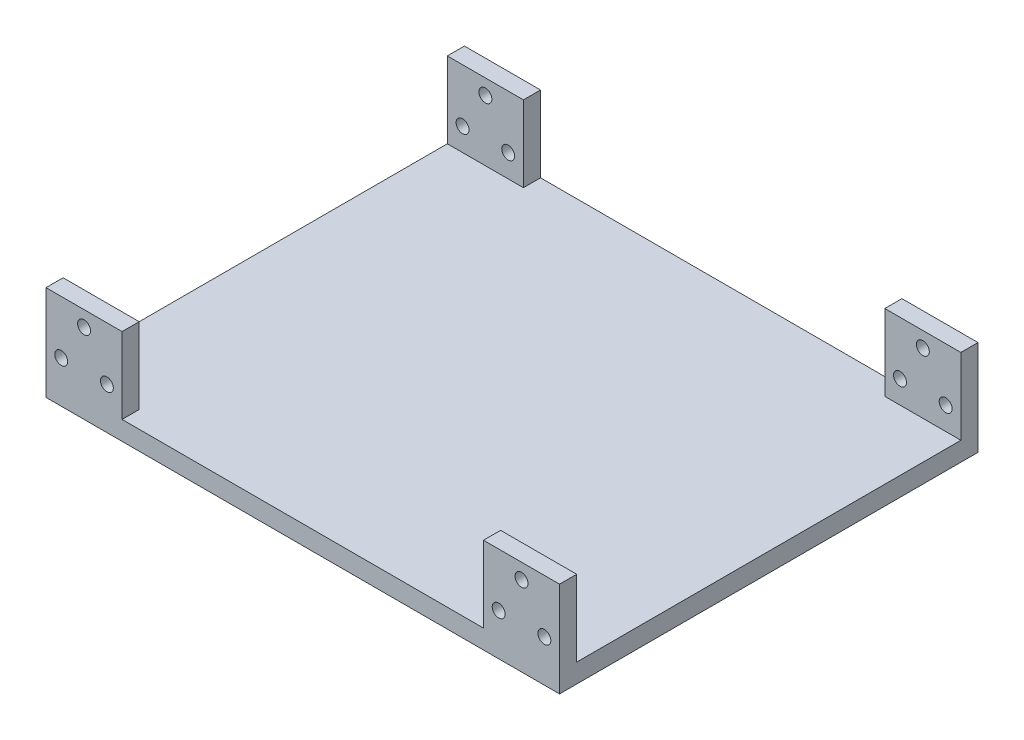
ISO-10303-21;
HEADER;
FILE_DESCRIPTION(('STEP AP214'),'2;1');
FILE_NAME('part.step','',(''),(''),'','','');
FILE_SCHEMA(('AUTOMOTIVE_DESIGN { 1 0 10303 214 1 1 1 1 }'));
ENDSEC;
DATA;
#1=APPLICATION_CONTEXT('core data for automotive mechanical design processes');
#2=APPLICATION_PROTOCOL_DEFINITION('international standard','automotive_design',2000,#1);
#3=PRODUCT_CONTEXT('',#1,'mechanical');
#4=PRODUCT('Part','Part','',(#3));
#5=PRODUCT_RELATED_PRODUCT_CATEGORY('part','',(#4));
#6=PRODUCT_DEFINITION_FORMATION('','',#4);
#7=PRODUCT_DEFINITION_CONTEXT('part definition',#1,'design');
#8=PRODUCT_DEFINITION('design','',#6,#7);
#9=PRODUCT_DEFINITION_SHAPE('','',#8);
#10=(LENGTH_UNIT() NAMED_UNIT(*) SI_UNIT(.MILLI.,.METRE.));
#11=(NAMED_UNIT(*) PLANE_ANGLE_UNIT() SI_UNIT($,.RADIAN.));
#12=(NAMED_UNIT(*) SI_UNIT($,.STERADIAN.) SOLID_ANGLE_UNIT());
#13=UNCERTAINTY_MEASURE_WITH_UNIT(LENGTH_MEASURE(1.E-05),#10,'distance_accuracy_value','');
#14=(GEOMETRIC_REPRESENTATION_CONTEXT(3) GLOBAL_UNCERTAINTY_ASSIGNED_CONTEXT((#13)) GLOBAL_UNIT_ASSIGNED_CONTEXT((#10,
#11,#12)) REPRESENTATION_CONTEXT('',''));
#15=CARTESIAN_POINT('',(0.,0.,0.));
#16=DIRECTION('',(0.,0.,1.));
#17=DIRECTION('',(1.,0.,0.));
#18=AXIS2_PLACEMENT_3D('',#15,#16,#17);
#19=CARTESIAN_POINT('',(0.,5.,0.));
#20=DIRECTION('',(0.,-1.,0.));
#21=DIRECTION('',(0.,0.,-1.));
#22=AXIS2_PLACEMENT_3D('',#19,#20,#21);
#23=PLANE('',#22);
#24=DIRECTION('',(-1.,0.,0.));
#25=VECTOR('',#24,1.);
#26=CARTESIAN_POINT('',(67.5,5.,50.5));
#27=LINE('',#26,#25);
#28=CARTESIAN_POINT('',(67.5,5.,50.5));
#29=VERTEX_POINT('',#28);
#30=CARTESIAN_POINT('',(47.5,5.,50.5));
#31=VERTEX_POINT('',#30);
#32=EDGE_CURVE('E61',#29,#31,#27,.T.);
#33=ORIENTED_EDGE('',*,*,#32,.F.);
#34=DIRECTION('',(0.,0.,-1.));
#35=VECTOR('',#34,1.);
#36=CARTESIAN_POINT('',(67.5,5.,55.));
#37=LINE('',#36,#35);
#38=CARTESIAN_POINT('',(67.5,5.,-50.5));
#39=VERTEX_POINT('',#38);
#40=EDGE_CURVE('E305',#29,#39,#37,.T.);
#41=ORIENTED_EDGE('',*,*,#40,.T.);
#42=DIRECTION('',(1.,0.,0.));
#43=VECTOR('',#42,1.);
#44=CARTESIAN_POINT('',(67.5,5.,-50.5));
#45=LINE('',#44,#43);
#46=CARTESIAN_POINT('',(47.5,5.,-50.5));
#47=VERTEX_POINT('',#46);
#48=EDGE_CURVE('E277',#47,#39,#45,.T.);
#49=ORIENTED_EDGE('',*,*,#48,.F.);
#50=DIRECTION('',(0.,0.,1.));
#51=VECTOR('',#50,1.);
#52=CARTESIAN_POINT('',(47.5,5.,-55.));
#53=LINE('',#52,#51);
#54=CARTESIAN_POINT('',(47.5,5.,-55.));
#55=VERTEX_POINT('',#54);
#56=EDGE_CURVE('E271',#55,#47,#53,.T.);
#57=ORIENTED_EDGE('',*,*,#56,.F.);
#58=DIRECTION('',(-1.,0.,0.));
#59=VECTOR('',#58,1.);
#60=CARTESIAN_POINT('',(-67.5,5.,-55.));
#61=LINE('',#60,#59);
#62=CARTESIAN_POINT('',(-47.5,5.,-55.));
#63=VERTEX_POINT('',#62);
#64=EDGE_CURVE('E308',#55,#63,#61,.T.);
#65=ORIENTED_EDGE('',*,*,#64,.T.);
#66=DIRECTION('',(0.,0.,-1.));
#67=VECTOR('',#66,1.);
#68=CARTESIAN_POINT('',(-47.5,5.,-55.));
#69=LINE('',#68,#67);
#70=CARTESIAN_POINT('',(-47.5,5.,-50.5));
#71=VERTEX_POINT('',#70);
#72=EDGE_CURVE('E244',#71,#63,#69,.T.);
#73=ORIENTED_EDGE('',*,*,#72,.F.);
#74=DIRECTION('',(1.,0.,0.));
#75=VECTOR('',#74,1.);
#76=CARTESIAN_POINT('',(-67.5,5.,-50.5));
#77=LINE('',#76,#75);
#78=CARTESIAN_POINT('',(-67.5,5.,-50.5));
#79=VERTEX_POINT('',#78);
#80=EDGE_CURVE('E238',#79,#71,#77,.T.);
#81=ORIENTED_EDGE('',*,*,#80,.F.);
#82=DIRECTION('',(0.,0.,1.));
#83=VECTOR('',#82,1.);
#84=CARTESIAN_POINT('',(-67.5,5.,55.));
#85=LINE('',#84,#83);
#86=CARTESIAN_POINT('',(-67.5,5.,50.5));
#87=VERTEX_POINT('',#86);
#88=EDGE_CURVE('E311',#79,#87,#85,.T.);
#89=ORIENTED_EDGE('',*,*,#88,.T.);
#90=DIRECTION('',(-1.,0.,0.));
#91=VECTOR('',#90,1.);
#92=CARTESIAN_POINT('',(-67.5,5.,50.5));
#93=LINE('',#92,#91);
#94=CARTESIAN_POINT('',(-47.5,5.,50.5));
#95=VERTEX_POINT('',#94);
#96=EDGE_CURVE('E211',#95,#87,#93,.T.);
#97=ORIENTED_EDGE('',*,*,#96,.F.);
#98=DIRECTION('',(0.,0.,-1.));
#99=VECTOR('',#98,1.);
#100=CARTESIAN_POINT('',(-47.5,5.,55.));
#101=LINE('',#100,#99);
#102=CARTESIAN_POINT('',(-47.5,5.,55.));
#103=VERTEX_POINT('',#102);
#104=EDGE_CURVE('E205',#103,#95,#101,.T.);
#105=ORIENTED_EDGE('',*,*,#104,.F.);
#106=DIRECTION('',(1.,0.,0.));
#107=VECTOR('',#106,1.);
#108=CARTESIAN_POINT('',(-67.5,5.,55.));
#109=LINE('',#108,#107);
#110=CARTESIAN_POINT('',(47.5,5.,55.));
#111=VERTEX_POINT('',#110);
#112=EDGE_CURVE('E167',#103,#111,#109,.T.);
#113=ORIENTED_EDGE('',*,*,#112,.T.);
#114=DIRECTION('',(0.,0.,1.));
#115=VECTOR('',#114,1.);
#116=CARTESIAN_POINT('',(47.5,5.,55.));
#117=LINE('',#116,#115);
#118=EDGE_CURVE('E57',#31,#111,#117,.T.);
#119=ORIENTED_EDGE('',*,*,#118,.F.);
#120=EDGE_LOOP('',(#33,#41,#49,#57,#65,#73,#81,#89,#97,#105,#113,#119));
#121=FACE_BOUND('',#120,.T.);
#122=ADVANCED_FACE('F39',(#121),#23,.F.);
#123=CARTESIAN_POINT('',(67.5,5.,55.));
#124=DIRECTION('',(-1.,0.,0.));
#125=DIRECTION('',(0.,0.,1.));
#126=AXIS2_PLACEMENT_3D('',#123,#124,#125);
#127=PLANE('',#126);
#128=DIRECTION('',(0.,0.,-1.));
#129=VECTOR('',#128,1.);
#130=CARTESIAN_POINT('',(67.5,0.,55.));
#131=LINE('',#130,#129);
#132=CARTESIAN_POINT('',(67.5,0.,55.));
#133=VERTEX_POINT('',#132);
#134=CARTESIAN_POINT('',(67.5,0.,-55.));
#135=VERTEX_POINT('',#134);
#136=EDGE_CURVE('E304',#133,#135,#131,.T.);
#137=ORIENTED_EDGE('',*,*,#136,.T.);
#138=DIRECTION('',(0.,-1.,0.));
#139=VECTOR('',#138,1.);
#140=CARTESIAN_POINT('',(67.5,5.,-55.));
#141=LINE('',#140,#139);
#142=CARTESIAN_POINT('',(67.5,25.,-55.));
#143=VERTEX_POINT('',#142);
#144=EDGE_CURVE('E11',#143,#135,#141,.T.);
#145=ORIENTED_EDGE('',*,*,#144,.F.);
#146=DIRECTION('',(0.,0.,-1.));
#147=VECTOR('',#146,1.);
#148=CARTESIAN_POINT('',(67.5,25.,-55.));
#149=LINE('',#148,#147);
#150=CARTESIAN_POINT('',(67.5,25.,-50.5));
#151=VERTEX_POINT('',#150);
#152=EDGE_CURVE('E272',#151,#143,#149,.T.);
#153=ORIENTED_EDGE('',*,*,#152,.F.);
#154=DIRECTION('',(0.,-1.,0.));
#155=VECTOR('',#154,1.);
#156=CARTESIAN_POINT('',(67.5,25.,-50.5));
#157=LINE('',#156,#155);
#158=EDGE_CURVE('E286',#151,#39,#157,.T.);
#159=ORIENTED_EDGE('',*,*,#158,.T.);
#160=ORIENTED_EDGE('',*,*,#40,.F.);
#161=DIRECTION('',(0.,-1.,0.));
#162=VECTOR('',#161,1.);
#163=CARTESIAN_POINT('',(67.5,25.,50.5));
#164=LINE('',#163,#162);
#165=CARTESIAN_POINT('',(67.5,25.,50.5));
#166=VERTEX_POINT('',#165);
#167=EDGE_CURVE('E172',#166,#29,#164,.T.);
#168=ORIENTED_EDGE('',*,*,#167,.F.);
#169=DIRECTION('',(0.,0.,-1.));
#170=VECTOR('',#169,1.);
#171=CARTESIAN_POINT('',(67.5,25.,55.));
#172=LINE('',#171,#170);
#173=CARTESIAN_POINT('',(67.5,25.,55.));
#174=VERTEX_POINT('',#173);
#175=EDGE_CURVE('E170',#174,#166,#172,.T.);
#176=ORIENTED_EDGE('',*,*,#175,.F.);
#177=DIRECTION('',(0.,-1.,0.));
#178=VECTOR('',#177,1.);
#179=CARTESIAN_POINT('',(67.5,5.,55.));
#180=LINE('',#179,#178);
#181=EDGE_CURVE('E153',#174,#133,#180,.T.);
#182=ORIENTED_EDGE('',*,*,#181,.T.);
#183=EDGE_LOOP('',(#137,#145,#153,#159,#160,#168,#176,#182));
#184=FACE_BOUND('',#183,.T.);
#185=ADVANCED_FACE('F41',(#184),#127,.F.);
#186=CARTESIAN_POINT('',(-67.5,5.,-55.));
#187=DIRECTION('',(0.,0.,1.));
#188=DIRECTION('',(1.,0.,0.));
#189=AXIS2_PLACEMENT_3D('',#186,#187,#188);
#190=PLANE('',#189);
#191=CARTESIAN_POINT('',(57.5,21.,-55.));
#192=DIRECTION('',(0.,0.,-1.));
#193=DIRECTION('',(1.,0.,0.));
#194=AXIS2_PLACEMENT_3D('',#191,#192,#193);
#195=CIRCLE('',#194,1.7);
#196=CARTESIAN_POINT('',(59.2,21.,-55.));
#197=VERTEX_POINT('',#196);
#198=EDGE_CURVE('E444',#197,#197,#195,.T.);
#199=ORIENTED_EDGE('',*,*,#198,.F.);
#200=EDGE_LOOP('',(#199));
#201=FACE_BOUND('',#200,.T.);
#202=CARTESIAN_POINT('',(63.5,11.,-55.));
#203=DIRECTION('',(0.,0.,-1.));
#204=DIRECTION('',(1.,0.,0.));
#205=AXIS2_PLACEMENT_3D('',#202,#203,#204);
#206=CIRCLE('',#205,1.7);
#207=CARTESIAN_POINT('',(65.2,11.,-55.));
#208=VERTEX_POINT('',#207);
#209=EDGE_CURVE('E448',#208,#208,#206,.T.);
#210=ORIENTED_EDGE('',*,*,#209,.F.);
#211=EDGE_LOOP('',(#210));
#212=FACE_BOUND('',#211,.T.);
#213=CARTESIAN_POINT('',(51.5,11.,-55.));
#214=DIRECTION('',(0.,0.,-1.));
#215=DIRECTION('',(1.,0.,0.));
#216=AXIS2_PLACEMENT_3D('',#213,#214,#215);
#217=CIRCLE('',#216,1.7);
#218=CARTESIAN_POINT('',(53.2,11.,-55.));
#219=VERTEX_POINT('',#218);
#220=EDGE_CURVE('E452',#219,#219,#217,.T.);
#221=ORIENTED_EDGE('',*,*,#220,.F.);
#222=EDGE_LOOP('',(#221));
#223=FACE_BOUND('',#222,.T.);
#224=CARTESIAN_POINT('',(-63.5,11.,-55.));
#225=DIRECTION('',(0.,0.,-1.));
#226=DIRECTION('',(-1.,0.,0.));
#227=AXIS2_PLACEMENT_3D('',#224,#225,#226);
#228=CIRCLE('',#227,1.7);
#229=CARTESIAN_POINT('',(-65.2,11.,-55.));
#230=VERTEX_POINT('',#229);
#231=EDGE_CURVE('E456',#230,#230,#228,.T.);
#232=ORIENTED_EDGE('',*,*,#231,.F.);
#233=EDGE_LOOP('',(#232));
#234=FACE_BOUND('',#233,.T.);
#235=CARTESIAN_POINT('',(-51.5,11.,-55.));
#236=DIRECTION('',(0.,0.,-1.));
#237=DIRECTION('',(-1.,0.,0.));
#238=AXIS2_PLACEMENT_3D('',#235,#236,#237);
#239=CIRCLE('',#238,1.7);
#240=CARTESIAN_POINT('',(-53.2,11.,-55.));
#241=VERTEX_POINT('',#240);
#242=EDGE_CURVE('E460',#241,#241,#239,.T.);
#243=ORIENTED_EDGE('',*,*,#242,.F.);
#244=EDGE_LOOP('',(#243));
#245=FACE_BOUND('',#244,.T.);
#246=CARTESIAN_POINT('',(-57.5,21.,-55.));
#247=DIRECTION('',(0.,0.,-1.));
#248=DIRECTION('',(-1.,0.,0.));
#249=AXIS2_PLACEMENT_3D('',#246,#247,#248);
#250=CIRCLE('',#249,1.7);
#251=CARTESIAN_POINT('',(-59.2,21.,-55.));
#252=VERTEX_POINT('',#251);
#253=EDGE_CURVE('E336',#252,#252,#250,.T.);
#254=ORIENTED_EDGE('',*,*,#253,.F.);
#255=EDGE_LOOP('',(#254));
#256=FACE_BOUND('',#255,.T.);
#257=DIRECTION('',(-1.,0.,0.));
#258=VECTOR('',#257,1.);
#259=CARTESIAN_POINT('',(-67.5,0.,-55.));
#260=LINE('',#259,#258);
#261=CARTESIAN_POINT('',(-67.5,0.,-55.));
#262=VERTEX_POINT('',#261);
#263=EDGE_CURVE('E318',#135,#262,#260,.T.);
#264=ORIENTED_EDGE('',*,*,#263,.T.);
#265=DIRECTION('',(0.,-1.,0.));
#266=VECTOR('',#265,1.);
#267=CARTESIAN_POINT('',(-67.5,5.,-55.));
#268=LINE('',#267,#266);
#269=CARTESIAN_POINT('',(-67.5,25.,-55.));
#270=VERTEX_POINT('',#269);
#271=EDGE_CURVE('E49',#270,#262,#268,.T.);
#272=ORIENTED_EDGE('',*,*,#271,.F.);
#273=DIRECTION('',(-1.,0.,0.));
#274=VECTOR('',#273,1.);
#275=CARTESIAN_POINT('',(-67.5,25.,-55.));
#276=LINE('',#275,#274);
#277=CARTESIAN_POINT('',(-47.5,25.,-55.));
#278=VERTEX_POINT('',#277);
#279=EDGE_CURVE('E239',#278,#270,#276,.T.);
#280=ORIENTED_EDGE('',*,*,#279,.F.);
#281=DIRECTION('',(0.,-1.,0.));
#282=VECTOR('',#281,1.);
#283=CARTESIAN_POINT('',(-47.5,25.,-55.));
#284=LINE('',#283,#282);
#285=EDGE_CURVE('E253',#278,#63,#284,.T.);
#286=ORIENTED_EDGE('',*,*,#285,.T.);
#287=ORIENTED_EDGE('',*,*,#64,.F.);
#288=DIRECTION('',(0.,-1.,0.));
#289=VECTOR('',#288,1.);
#290=CARTESIAN_POINT('',(47.5,25.,-55.));
#291=LINE('',#290,#289);
#292=CARTESIAN_POINT('',(47.5,25.,-55.));
#293=VERTEX_POINT('',#292);
#294=EDGE_CURVE('E300',#293,#55,#291,.T.);
#295=ORIENTED_EDGE('',*,*,#294,.F.);
#296=DIRECTION('',(-1.,0.,0.));
#297=VECTOR('',#296,1.);
#298=CARTESIAN_POINT('',(67.5,25.,-55.));
#299=LINE('',#298,#297);
#300=EDGE_CURVE('E276',#143,#293,#299,.T.);
#301=ORIENTED_EDGE('',*,*,#300,.F.);
#302=ORIENTED_EDGE('',*,*,#144,.T.);
#303=EDGE_LOOP('',(#264,#272,#280,#286,#287,#295,#301,#302));
#304=FACE_BOUND('',#303,.T.);
#305=ADVANCED_FACE('F426',(#201,#212,#223,#234,#245,#256,#304),#190,.F.);
#306=CARTESIAN_POINT('',(-67.5,5.,55.));
#307=DIRECTION('',(1.,0.,0.));
#308=DIRECTION('',(0.,0.,-1.));
#309=AXIS2_PLACEMENT_3D('',#306,#307,#308);
#310=PLANE('',#309);
#311=DIRECTION('',(0.,0.,1.));
#312=VECTOR('',#311,1.);
#313=CARTESIAN_POINT('',(-67.5,0.,55.));
#314=LINE('',#313,#312);
#315=CARTESIAN_POINT('',(-67.5,0.,55.));
#316=VERTEX_POINT('',#315);
#317=EDGE_CURVE('E321',#262,#316,#314,.T.);
#318=ORIENTED_EDGE('',*,*,#317,.T.);
#319=DIRECTION('',(0.,-1.,0.));
#320=VECTOR('',#319,1.);
#321=CARTESIAN_POINT('',(-67.5,5.,55.));
#322=LINE('',#321,#320);
#323=CARTESIAN_POINT('',(-67.5,25.,55.));
#324=VERTEX_POINT('',#323);
#325=EDGE_CURVE('E166',#324,#316,#322,.T.);
#326=ORIENTED_EDGE('',*,*,#325,.F.);
#327=DIRECTION('',(0.,0.,1.));
#328=VECTOR('',#327,1.);
#329=CARTESIAN_POINT('',(-67.5,25.,55.));
#330=LINE('',#329,#328);
#331=CARTESIAN_POINT('',(-67.5,25.,50.5));
#332=VERTEX_POINT('',#331);
#333=EDGE_CURVE('E206',#332,#324,#330,.T.);
#334=ORIENTED_EDGE('',*,*,#333,.F.);
#335=DIRECTION('',(0.,-1.,0.));
#336=VECTOR('',#335,1.);
#337=CARTESIAN_POINT('',(-67.5,25.,50.5));
#338=LINE('',#337,#336);
#339=EDGE_CURVE('E220',#332,#87,#338,.T.);
#340=ORIENTED_EDGE('',*,*,#339,.T.);
#341=ORIENTED_EDGE('',*,*,#88,.F.);
#342=DIRECTION('',(0.,-1.,0.));
#343=VECTOR('',#342,1.);
#344=CARTESIAN_POINT('',(-67.5,25.,-50.5));
#345=LINE('',#344,#343);
#346=CARTESIAN_POINT('',(-67.5,25.,-50.5));
#347=VERTEX_POINT('',#346);
#348=EDGE_CURVE('E267',#347,#79,#345,.T.);
#349=ORIENTED_EDGE('',*,*,#348,.F.);
#350=DIRECTION('',(0.,0.,1.));
#351=VECTOR('',#350,1.);
#352=CARTESIAN_POINT('',(-67.5,25.,-55.));
#353=LINE('',#352,#351);
#354=EDGE_CURVE('E243',#270,#347,#353,.T.);
#355=ORIENTED_EDGE('',*,*,#354,.F.);
#356=ORIENTED_EDGE('',*,*,#271,.T.);
#357=EDGE_LOOP('',(#318,#326,#334,#340,#341,#349,#355,#356));
#358=FACE_BOUND('',#357,.T.);
#359=ADVANCED_FACE('F402',(#358),#310,.F.);
#360=CARTESIAN_POINT('',(-67.5,5.,55.));
#361=DIRECTION('',(0.,0.,-1.));
#362=DIRECTION('',(-1.,0.,0.));
#363=AXIS2_PLACEMENT_3D('',#360,#361,#362);
#364=PLANE('',#363);
#365=CARTESIAN_POINT('',(57.5,21.,55.));
#366=DIRECTION('',(0.,0.,-1.));
#367=DIRECTION('',(-1.,0.,0.));
#368=AXIS2_PLACEMENT_3D('',#365,#366,#367);
#369=CIRCLE('',#368,1.7);
#370=CARTESIAN_POINT('',(55.8,21.,55.));
#371=VERTEX_POINT('',#370);
#372=EDGE_CURVE('E353',#371,#371,#369,.T.);
#373=ORIENTED_EDGE('',*,*,#372,.T.);
#374=EDGE_LOOP('',(#373));
#375=FACE_BOUND('',#374,.T.);
#376=CARTESIAN_POINT('',(63.5,11.,55.));
#377=DIRECTION('',(0.,0.,-1.));
#378=DIRECTION('',(-1.,0.,0.));
#379=AXIS2_PLACEMENT_3D('',#376,#377,#378);
#380=CIRCLE('',#379,1.7);
#381=CARTESIAN_POINT('',(61.8,11.,55.));
#382=VERTEX_POINT('',#381);
#383=EDGE_CURVE('E348',#382,#382,#380,.T.);
#384=ORIENTED_EDGE('',*,*,#383,.T.);
#385=EDGE_LOOP('',(#384));
#386=FACE_BOUND('',#385,.T.);
#387=CARTESIAN_POINT('',(51.5,11.,55.));
#388=DIRECTION('',(0.,0.,-1.));
#389=DIRECTION('',(-1.,0.,0.));
#390=AXIS2_PLACEMENT_3D('',#387,#388,#389);
#391=CIRCLE('',#390,1.7);
#392=CARTESIAN_POINT('',(49.8,11.,55.));
#393=VERTEX_POINT('',#392);
#394=EDGE_CURVE('E342',#393,#393,#391,.T.);
#395=ORIENTED_EDGE('',*,*,#394,.T.);
#396=EDGE_LOOP('',(#395));
#397=FACE_BOUND('',#396,.T.);
#398=CARTESIAN_POINT('',(-63.5,11.,55.));
#399=DIRECTION('',(0.,0.,-1.));
#400=DIRECTION('',(-1.,0.,0.));
#401=AXIS2_PLACEMENT_3D('',#398,#399,#400);
#402=CIRCLE('',#401,1.7);
#403=CARTESIAN_POINT('',(-65.2,11.,55.));
#404=VERTEX_POINT('',#403);
#405=EDGE_CURVE('E187',#404,#404,#402,.T.);
#406=ORIENTED_EDGE('',*,*,#405,.T.);
#407=EDGE_LOOP('',(#406));
#408=FACE_BOUND('',#407,.T.);
#409=CARTESIAN_POINT('',(-51.5,11.,55.));
#410=DIRECTION('',(0.,0.,-1.));
#411=DIRECTION('',(-1.,0.,0.));
#412=AXIS2_PLACEMENT_3D('',#409,#410,#411);
#413=CIRCLE('',#412,1.7);
#414=CARTESIAN_POINT('',(-53.2,11.,55.));
#415=VERTEX_POINT('',#414);
#416=EDGE_CURVE('E364',#415,#415,#413,.T.);
#417=ORIENTED_EDGE('',*,*,#416,.T.);
#418=EDGE_LOOP('',(#417));
#419=FACE_BOUND('',#418,.T.);
#420=CARTESIAN_POINT('',(-57.5,21.,55.));
#421=DIRECTION('',(0.,0.,-1.));
#422=DIRECTION('',(-1.,0.,0.));
#423=AXIS2_PLACEMENT_3D('',#420,#421,#422);
#424=CIRCLE('',#423,1.7);
#425=CARTESIAN_POINT('',(-59.2,21.,55.));
#426=VERTEX_POINT('',#425);
#427=EDGE_CURVE('E358',#426,#426,#424,.T.);
#428=ORIENTED_EDGE('',*,*,#427,.T.);
#429=EDGE_LOOP('',(#428));
#430=FACE_BOUND('',#429,.T.);
#431=DIRECTION('',(1.,0.,0.));
#432=VECTOR('',#431,1.);
#433=CARTESIAN_POINT('',(-67.5,0.,55.));
#434=LINE('',#433,#432);
#435=EDGE_CURVE('E161',#316,#133,#434,.T.);
#436=ORIENTED_EDGE('',*,*,#435,.T.);
#437=ORIENTED_EDGE('',*,*,#181,.F.);
#438=DIRECTION('',(1.,0.,0.));
#439=VECTOR('',#438,1.);
#440=CARTESIAN_POINT('',(67.5,25.,55.));
#441=LINE('',#440,#439);
#442=CARTESIAN_POINT('',(47.5,25.,55.));
#443=VERTEX_POINT('',#442);
#444=EDGE_CURVE('E158',#443,#174,#441,.T.);
#445=ORIENTED_EDGE('',*,*,#444,.F.);
#446=DIRECTION('',(0.,-1.,0.));
#447=VECTOR('',#446,1.);
#448=CARTESIAN_POINT('',(47.5,25.,55.));
#449=LINE('',#448,#447);
#450=EDGE_CURVE('E194',#443,#111,#449,.T.);
#451=ORIENTED_EDGE('',*,*,#450,.T.);
#452=ORIENTED_EDGE('',*,*,#112,.F.);
#453=DIRECTION('',(0.,-1.,0.));
#454=VECTOR('',#453,1.);
#455=CARTESIAN_POINT('',(-47.5,25.,55.));
#456=LINE('',#455,#454);
#457=CARTESIAN_POINT('',(-47.5,25.,55.));
#458=VERTEX_POINT('',#457);
#459=EDGE_CURVE('E234',#458,#103,#456,.T.);
#460=ORIENTED_EDGE('',*,*,#459,.F.);
#461=DIRECTION('',(1.,0.,0.));
#462=VECTOR('',#461,1.);
#463=CARTESIAN_POINT('',(-67.5,25.,55.));
#464=LINE('',#463,#462);
#465=EDGE_CURVE('E210',#324,#458,#464,.T.);
#466=ORIENTED_EDGE('',*,*,#465,.F.);
#467=ORIENTED_EDGE('',*,*,#325,.T.);
#468=EDGE_LOOP('',(#436,#437,#445,#451,#452,#460,#466,#467));
#469=FACE_BOUND('',#468,.T.);
#470=ADVANCED_FACE('F155',(#375,#386,#397,#408,#419,#430,#469),#364,.F.);
#471=CARTESIAN_POINT('',(0.,0.,0.));
#472=DIRECTION('',(0.,-1.,0.));
#473=DIRECTION('',(0.,0.,-1.));
#474=AXIS2_PLACEMENT_3D('',#471,#472,#473);
#475=PLANE('',#474);
#476=CARTESIAN_POINT('',(0.,0.,0.));
#477=DIRECTION('',(0.,-1.,0.));
#478=DIRECTION('',(0.,0.,-1.));
#479=AXIS2_PLACEMENT_3D('',#476,#477,#478);
#480=CIRCLE('',#479,45.1);
#481=CARTESIAN_POINT('',(0.,0.,-45.1));
#482=VERTEX_POINT('',#481);
#483=EDGE_CURVE('E587',#482,#482,#480,.T.);
#484=ORIENTED_EDGE('',*,*,#483,.F.);
#485=EDGE_LOOP('',(#484));
#486=FACE_BOUND('',#485,.T.);
#487=ORIENTED_EDGE('',*,*,#136,.F.);
#488=ORIENTED_EDGE('',*,*,#435,.F.);
#489=ORIENTED_EDGE('',*,*,#317,.F.);
#490=ORIENTED_EDGE('',*,*,#263,.F.);
#491=EDGE_LOOP('',(#487,#488,#489,#490));
#492=FACE_BOUND('',#491,.T.);
#493=ADVANCED_FACE('F401',(#486,#492),#475,.T.);
#494=CARTESIAN_POINT('',(47.5,25.,-55.));
#495=DIRECTION('',(1.,0.,0.));
#496=DIRECTION('',(0.,0.,-1.));
#497=AXIS2_PLACEMENT_3D('',#494,#495,#496);
#498=PLANE('',#497);
#499=ORIENTED_EDGE('',*,*,#56,.T.);
#500=DIRECTION('',(0.,-1.,0.));
#501=VECTOR('',#500,1.);
#502=CARTESIAN_POINT('',(47.5,25.,-50.5));
#503=LINE('',#502,#501);
#504=CARTESIAN_POINT('',(47.5,25.,-50.5));
#505=VERTEX_POINT('',#504);
#506=EDGE_CURVE('E296',#505,#47,#503,.T.);
#507=ORIENTED_EDGE('',*,*,#506,.F.);
#508=DIRECTION('',(0.,0.,1.));
#509=VECTOR('',#508,1.);
#510=CARTESIAN_POINT('',(47.5,25.,-55.));
#511=LINE('',#510,#509);
#512=EDGE_CURVE('E280',#293,#505,#511,.T.);
#513=ORIENTED_EDGE('',*,*,#512,.F.);
#514=ORIENTED_EDGE('',*,*,#294,.T.);
#515=EDGE_LOOP('',(#499,#507,#513,#514));
#516=FACE_BOUND('',#515,.T.);
#517=ADVANCED_FACE('F429',(#516),#498,.F.);
#518=CARTESIAN_POINT('',(67.5,25.,-50.5));
#519=DIRECTION('',(0.,0.,-1.));
#520=DIRECTION('',(-1.,0.,0.));
#521=AXIS2_PLACEMENT_3D('',#518,#519,#520);
#522=PLANE('',#521);
#523=CARTESIAN_POINT('',(57.5,21.,-50.5));
#524=DIRECTION('',(0.,0.,-1.));
#525=DIRECTION('',(-1.,0.,0.));
#526=AXIS2_PLACEMENT_3D('',#523,#524,#525);
#527=CIRCLE('',#526,1.7);
#528=CARTESIAN_POINT('',(55.8,21.,-50.5));
#529=VERTEX_POINT('',#528);
#530=EDGE_CURVE('E347',#529,#529,#527,.T.);
#531=ORIENTED_EDGE('',*,*,#530,.T.);
#532=EDGE_LOOP('',(#531));
#533=FACE_BOUND('',#532,.T.);
#534=CARTESIAN_POINT('',(63.5,11.,-50.5));
#535=DIRECTION('',(0.,0.,-1.));
#536=DIRECTION('',(-1.,0.,0.));
#537=AXIS2_PLACEMENT_3D('',#534,#535,#536);
#538=CIRCLE('',#537,1.7);
#539=CARTESIAN_POINT('',(61.8,11.,-50.5));
#540=VERTEX_POINT('',#539);
#541=EDGE_CURVE('E341',#540,#540,#538,.T.);
#542=ORIENTED_EDGE('',*,*,#541,.T.);
#543=EDGE_LOOP('',(#542));
#544=FACE_BOUND('',#543,.T.);
#545=CARTESIAN_POINT('',(51.5,11.,-50.5));
#546=DIRECTION('',(0.,0.,-1.));
#547=DIRECTION('',(-1.,0.,0.));
#548=AXIS2_PLACEMENT_3D('',#545,#546,#547);
#549=CIRCLE('',#548,1.7);
#550=CARTESIAN_POINT('',(49.8,11.,-50.5));
#551=VERTEX_POINT('',#550);
#552=EDGE_CURVE('E335',#551,#551,#549,.T.);
#553=ORIENTED_EDGE('',*,*,#552,.T.);
#554=EDGE_LOOP('',(#553));
#555=FACE_BOUND('',#554,.T.);
#556=ORIENTED_EDGE('',*,*,#48,.T.);
#557=ORIENTED_EDGE('',*,*,#158,.F.);
#558=DIRECTION('',(1.,0.,0.));
#559=VECTOR('',#558,1.);
#560=CARTESIAN_POINT('',(67.5,25.,-50.5));
#561=LINE('',#560,#559);
#562=EDGE_CURVE('E283',#505,#151,#561,.T.);
#563=ORIENTED_EDGE('',*,*,#562,.F.);
#564=ORIENTED_EDGE('',*,*,#506,.T.);
#565=EDGE_LOOP('',(#556,#557,#563,#564));
#566=FACE_BOUND('',#565,.T.);
#567=ADVANCED_FACE('F480',(#533,#544,#555,#566),#522,.F.);
#568=CARTESIAN_POINT('',(0.,25.,0.));
#569=DIRECTION('',(0.,-1.,0.));
#570=DIRECTION('',(0.,0.,-1.));
#571=AXIS2_PLACEMENT_3D('',#568,#569,#570);
#572=PLANE('',#571);
#573=ORIENTED_EDGE('',*,*,#152,.T.);
#574=ORIENTED_EDGE('',*,*,#300,.T.);
#575=ORIENTED_EDGE('',*,*,#512,.T.);
#576=ORIENTED_EDGE('',*,*,#562,.T.);
#577=EDGE_LOOP('',(#573,#574,#575,#576));
#578=FACE_BOUND('',#577,.T.);
#579=ADVANCED_FACE('F475',(#578),#572,.F.);
#580=CARTESIAN_POINT('',(-67.5,25.,-50.5));
#581=DIRECTION('',(0.,0.,-1.));
#582=DIRECTION('',(-1.,0.,0.));
#583=AXIS2_PLACEMENT_3D('',#580,#581,#582);
#584=PLANE('',#583);
#585=CARTESIAN_POINT('',(-63.5,11.,-50.5));
#586=DIRECTION('',(0.,0.,-1.));
#587=DIRECTION('',(-1.,0.,0.));
#588=AXIS2_PLACEMENT_3D('',#585,#586,#587);
#589=CIRCLE('',#588,1.7);
#590=CARTESIAN_POINT('',(-65.2,11.,-50.5));
#591=VERTEX_POINT('',#590);
#592=EDGE_CURVE('E377',#591,#591,#589,.T.);
#593=ORIENTED_EDGE('',*,*,#592,.T.);
#594=EDGE_LOOP('',(#593));
#595=FACE_BOUND('',#594,.T.);
#596=CARTESIAN_POINT('',(-51.5,11.,-50.5));
#597=DIRECTION('',(0.,0.,-1.));
#598=DIRECTION('',(-1.,0.,0.));
#599=AXIS2_PLACEMENT_3D('',#596,#597,#598);
#600=CIRCLE('',#599,1.7);
#601=CARTESIAN_POINT('',(-53.2,11.,-50.5));
#602=VERTEX_POINT('',#601);
#603=EDGE_CURVE('E357',#602,#602,#600,.T.);
#604=ORIENTED_EDGE('',*,*,#603,.T.);
#605=EDGE_LOOP('',(#604));
#606=FACE_BOUND('',#605,.T.);
#607=CARTESIAN_POINT('',(-57.5,21.,-50.5));
#608=DIRECTION('',(0.,0.,-1.));
#609=DIRECTION('',(-1.,0.,0.));
#610=AXIS2_PLACEMENT_3D('',#607,#608,#609);
#611=CIRCLE('',#610,1.7);
#612=CARTESIAN_POINT('',(-59.2,21.,-50.5));
#613=VERTEX_POINT('',#612);
#614=EDGE_CURVE('E352',#613,#613,#611,.T.);
#615=ORIENTED_EDGE('',*,*,#614,.T.);
#616=EDGE_LOOP('',(#615));
#617=FACE_BOUND('',#616,.T.);
#618=ORIENTED_EDGE('',*,*,#80,.T.);
#619=DIRECTION('',(0.,-1.,0.));
#620=VECTOR('',#619,1.);
#621=CARTESIAN_POINT('',(-47.5,25.,-50.5));
#622=LINE('',#621,#620);
#623=CARTESIAN_POINT('',(-47.5,25.,-50.5));
#624=VERTEX_POINT('',#623);
#625=EDGE_CURVE('E263',#624,#71,#622,.T.);
#626=ORIENTED_EDGE('',*,*,#625,.F.);
#627=DIRECTION('',(1.,0.,0.));
#628=VECTOR('',#627,1.);
#629=CARTESIAN_POINT('',(-67.5,25.,-50.5));
#630=LINE('',#629,#628);
#631=EDGE_CURVE('E247',#347,#624,#630,.T.);
#632=ORIENTED_EDGE('',*,*,#631,.F.);
#633=ORIENTED_EDGE('',*,*,#348,.T.);
#634=EDGE_LOOP('',(#618,#626,#632,#633));
#635=FACE_BOUND('',#634,.T.);
#636=ADVANCED_FACE('F517',(#595,#606,#617,#635),#584,.F.);
#637=CARTESIAN_POINT('',(-47.5,25.,-55.));
#638=DIRECTION('',(-1.,0.,0.));
#639=DIRECTION('',(0.,0.,1.));
#640=AXIS2_PLACEMENT_3D('',#637,#638,#639);
#641=PLANE('',#640);
#642=ORIENTED_EDGE('',*,*,#72,.T.);
#643=ORIENTED_EDGE('',*,*,#285,.F.);
#644=DIRECTION('',(0.,0.,-1.));
#645=VECTOR('',#644,1.);
#646=CARTESIAN_POINT('',(-47.5,25.,-55.));
#647=LINE('',#646,#645);
#648=EDGE_CURVE('E250',#624,#278,#647,.T.);
#649=ORIENTED_EDGE('',*,*,#648,.F.);
#650=ORIENTED_EDGE('',*,*,#625,.T.);
#651=EDGE_LOOP('',(#642,#643,#649,#650));
#652=FACE_BOUND('',#651,.T.);
#653=ADVANCED_FACE('F513',(#652),#641,.F.);
#654=CARTESIAN_POINT('',(0.,25.,0.));
#655=DIRECTION('',(0.,-1.,0.));
#656=DIRECTION('',(0.,0.,-1.));
#657=AXIS2_PLACEMENT_3D('',#654,#655,#656);
#658=PLANE('',#657);
#659=ORIENTED_EDGE('',*,*,#279,.T.);
#660=ORIENTED_EDGE('',*,*,#354,.T.);
#661=ORIENTED_EDGE('',*,*,#631,.T.);
#662=ORIENTED_EDGE('',*,*,#648,.T.);
#663=EDGE_LOOP('',(#659,#660,#661,#662));
#664=FACE_BOUND('',#663,.T.);
#665=ADVANCED_FACE('F507',(#664),#658,.F.);
#666=CARTESIAN_POINT('',(-47.5,25.,55.));
#667=DIRECTION('',(-1.,0.,0.));
#668=DIRECTION('',(0.,0.,1.));
#669=AXIS2_PLACEMENT_3D('',#666,#667,#668);
#670=PLANE('',#669);
#671=ORIENTED_EDGE('',*,*,#104,.T.);
#672=DIRECTION('',(0.,-1.,0.));
#673=VECTOR('',#672,1.);
#674=CARTESIAN_POINT('',(-47.5,25.,50.5));
#675=LINE('',#674,#673);
#676=CARTESIAN_POINT('',(-47.5,25.,50.5));
#677=VERTEX_POINT('',#676);
#678=EDGE_CURVE('E230',#677,#95,#675,.T.);
#679=ORIENTED_EDGE('',*,*,#678,.F.);
#680=DIRECTION('',(0.,0.,-1.));
#681=VECTOR('',#680,1.);
#682=CARTESIAN_POINT('',(-47.5,25.,55.));
#683=LINE('',#682,#681);
#684=EDGE_CURVE('E214',#458,#677,#683,.T.);
#685=ORIENTED_EDGE('',*,*,#684,.F.);
#686=ORIENTED_EDGE('',*,*,#459,.T.);
#687=EDGE_LOOP('',(#671,#679,#685,#686));
#688=FACE_BOUND('',#687,.T.);
#689=ADVANCED_FACE('F492',(#688),#670,.F.);
#690=CARTESIAN_POINT('',(-67.5,25.,50.5));
#691=DIRECTION('',(0.,0.,1.));
#692=DIRECTION('',(1.,0.,0.));
#693=AXIS2_PLACEMENT_3D('',#690,#691,#692);
#694=PLANE('',#693);
#695=CARTESIAN_POINT('',(-63.5,11.,50.5));
#696=DIRECTION('',(0.,0.,1.));
#697=DIRECTION('',(1.,0.,0.));
#698=AXIS2_PLACEMENT_3D('',#695,#696,#697);
#699=CIRCLE('',#698,1.7);
#700=CARTESIAN_POINT('',(-61.8,11.,50.5));
#701=VERTEX_POINT('',#700);
#702=EDGE_CURVE('E43',#701,#701,#699,.T.);
#703=ORIENTED_EDGE('',*,*,#702,.T.);
#704=EDGE_LOOP('',(#703));
#705=FACE_BOUND('',#704,.T.);
#706=CARTESIAN_POINT('',(-51.5,11.,50.5));
#707=DIRECTION('',(0.,0.,1.));
#708=DIRECTION('',(1.,0.,0.));
#709=AXIS2_PLACEMENT_3D('',#706,#707,#708);
#710=CIRCLE('',#709,1.7);
#711=CARTESIAN_POINT('',(-49.8,11.,50.5));
#712=VERTEX_POINT('',#711);
#713=EDGE_CURVE('E354',#712,#712,#710,.T.);
#714=ORIENTED_EDGE('',*,*,#713,.T.);
#715=EDGE_LOOP('',(#714));
#716=FACE_BOUND('',#715,.T.);
#717=CARTESIAN_POINT('',(-57.5,21.,50.5));
#718=DIRECTION('',(0.,0.,1.));
#719=DIRECTION('',(1.,0.,0.));
#720=AXIS2_PLACEMENT_3D('',#717,#718,#719);
#721=CIRCLE('',#720,1.7);
#722=CARTESIAN_POINT('',(-55.8,21.,50.5));
#723=VERTEX_POINT('',#722);
#724=EDGE_CURVE('E349',#723,#723,#721,.T.);
#725=ORIENTED_EDGE('',*,*,#724,.T.);
#726=EDGE_LOOP('',(#725));
#727=FACE_BOUND('',#726,.T.);
#728=ORIENTED_EDGE('',*,*,#96,.T.);
#729=ORIENTED_EDGE('',*,*,#339,.F.);
#730=DIRECTION('',(-1.,0.,0.));
#731=VECTOR('',#730,1.);
#732=CARTESIAN_POINT('',(-67.5,25.,50.5));
#733=LINE('',#732,#731);
#734=EDGE_CURVE('E217',#677,#332,#733,.T.);
#735=ORIENTED_EDGE('',*,*,#734,.F.);
#736=ORIENTED_EDGE('',*,*,#678,.T.);
#737=EDGE_LOOP('',(#728,#729,#735,#736));
#738=FACE_BOUND('',#737,.T.);
#739=ADVANCED_FACE('F388',(#705,#716,#727,#738),#694,.F.);
#740=CARTESIAN_POINT('',(0.,25.,0.));
#741=DIRECTION('',(0.,-1.,0.));
#742=DIRECTION('',(0.,0.,-1.));
#743=AXIS2_PLACEMENT_3D('',#740,#741,#742);
#744=PLANE('',#743);
#745=ORIENTED_EDGE('',*,*,#333,.T.);
#746=ORIENTED_EDGE('',*,*,#465,.T.);
#747=ORIENTED_EDGE('',*,*,#684,.T.);
#748=ORIENTED_EDGE('',*,*,#734,.T.);
#749=EDGE_LOOP('',(#745,#746,#747,#748));
#750=FACE_BOUND('',#749,.T.);
#751=ADVANCED_FACE('F495',(#750),#744,.F.);
#752=CARTESIAN_POINT('',(67.5,25.,50.5));
#753=DIRECTION('',(0.,0.,1.));
#754=DIRECTION('',(1.,0.,0.));
#755=AXIS2_PLACEMENT_3D('',#752,#753,#754);
#756=PLANE('',#755);
#757=CARTESIAN_POINT('',(57.5,21.,50.5));
#758=DIRECTION('',(0.,0.,1.));
#759=DIRECTION('',(1.,0.,0.));
#760=AXIS2_PLACEMENT_3D('',#757,#758,#759);
#761=CIRCLE('',#760,1.7);
#762=CARTESIAN_POINT('',(59.2,21.,50.5));
#763=VERTEX_POINT('',#762);
#764=EDGE_CURVE('E343',#763,#763,#761,.T.);
#765=ORIENTED_EDGE('',*,*,#764,.T.);
#766=EDGE_LOOP('',(#765));
#767=FACE_BOUND('',#766,.T.);
#768=CARTESIAN_POINT('',(63.5,11.,50.5));
#769=DIRECTION('',(0.,0.,1.));
#770=DIRECTION('',(1.,0.,0.));
#771=AXIS2_PLACEMENT_3D('',#768,#769,#770);
#772=CIRCLE('',#771,1.7);
#773=CARTESIAN_POINT('',(65.2,11.,50.5));
#774=VERTEX_POINT('',#773);
#775=EDGE_CURVE('E337',#774,#774,#772,.T.);
#776=ORIENTED_EDGE('',*,*,#775,.T.);
#777=EDGE_LOOP('',(#776));
#778=FACE_BOUND('',#777,.T.);
#779=CARTESIAN_POINT('',(51.5,11.,50.5));
#780=DIRECTION('',(0.,0.,1.));
#781=DIRECTION('',(1.,0.,0.));
#782=AXIS2_PLACEMENT_3D('',#779,#780,#781);
#783=CIRCLE('',#782,1.7);
#784=CARTESIAN_POINT('',(53.2,11.,50.5));
#785=VERTEX_POINT('',#784);
#786=EDGE_CURVE('E331',#785,#785,#783,.T.);
#787=ORIENTED_EDGE('',*,*,#786,.T.);
#788=EDGE_LOOP('',(#787));
#789=FACE_BOUND('',#788,.T.);
#790=ORIENTED_EDGE('',*,*,#32,.T.);
#791=DIRECTION('',(0.,-1.,0.));
#792=VECTOR('',#791,1.);
#793=CARTESIAN_POINT('',(47.5,25.,50.5));
#794=LINE('',#793,#792);
#795=CARTESIAN_POINT('',(47.5,25.,50.5));
#796=VERTEX_POINT('',#795);
#797=EDGE_CURVE('E199',#796,#31,#794,.T.);
#798=ORIENTED_EDGE('',*,*,#797,.F.);
#799=DIRECTION('',(-1.,0.,0.));
#800=VECTOR('',#799,1.);
#801=CARTESIAN_POINT('',(67.5,25.,50.5));
#802=LINE('',#801,#800);
#803=EDGE_CURVE('E176',#166,#796,#802,.T.);
#804=ORIENTED_EDGE('',*,*,#803,.F.);
#805=ORIENTED_EDGE('',*,*,#167,.T.);
#806=EDGE_LOOP('',(#790,#798,#804,#805));
#807=FACE_BOUND('',#806,.T.);
#808=ADVANCED_FACE('F482',(#767,#778,#789,#807),#756,.F.);
#809=CARTESIAN_POINT('',(47.5,25.,55.));
#810=DIRECTION('',(1.,0.,0.));
#811=DIRECTION('',(0.,0.,-1.));
#812=AXIS2_PLACEMENT_3D('',#809,#810,#811);
#813=PLANE('',#812);
#814=ORIENTED_EDGE('',*,*,#118,.T.);
#815=ORIENTED_EDGE('',*,*,#450,.F.);
#816=DIRECTION('',(0.,0.,1.));
#817=VECTOR('',#816,1.);
#818=CARTESIAN_POINT('',(47.5,25.,55.));
#819=LINE('',#818,#817);
#820=EDGE_CURVE('E180',#796,#443,#819,.T.);
#821=ORIENTED_EDGE('',*,*,#820,.F.);
#822=ORIENTED_EDGE('',*,*,#797,.T.);
#823=EDGE_LOOP('',(#814,#815,#821,#822));
#824=FACE_BOUND('',#823,.T.);
#825=ADVANCED_FACE('F485',(#824),#813,.F.);
#826=CARTESIAN_POINT('',(0.,25.,0.));
#827=DIRECTION('',(0.,-1.,0.));
#828=DIRECTION('',(0.,0.,-1.));
#829=AXIS2_PLACEMENT_3D('',#826,#827,#828);
#830=PLANE('',#829);
#831=ORIENTED_EDGE('',*,*,#444,.T.);
#832=ORIENTED_EDGE('',*,*,#175,.T.);
#833=ORIENTED_EDGE('',*,*,#803,.T.);
#834=ORIENTED_EDGE('',*,*,#820,.T.);
#835=EDGE_LOOP('',(#831,#832,#833,#834));
#836=FACE_BOUND('',#835,.T.);
#837=ADVANCED_FACE('F178',(#836),#830,.F.);
#838=CARTESIAN_POINT('',(51.5,11.,75.0000000000001));
#839=DIRECTION('',(0.,0.,-1.));
#840=DIRECTION('',(-1.,0.,0.));
#841=AXIS2_PLACEMENT_3D('',#838,#839,#840);
#842=CYLINDRICAL_SURFACE('',#841,1.7);
#843=ORIENTED_EDGE('',*,*,#786,.F.);
#844=EDGE_LOOP('',(#843));
#845=FACE_BOUND('',#844,.T.);
#846=ORIENTED_EDGE('',*,*,#394,.F.);
#847=EDGE_LOOP('',(#846));
#848=FACE_BOUND('',#847,.T.);
#849=ADVANCED_FACE('F564',(#845,#848),#842,.F.);
#850=CARTESIAN_POINT('',(63.5,11.,75.0000000000001));
#851=DIRECTION('',(0.,0.,-1.));
#852=DIRECTION('',(-1.,0.,0.));
#853=AXIS2_PLACEMENT_3D('',#850,#851,#852);
#854=CYLINDRICAL_SURFACE('',#853,1.7);
#855=ORIENTED_EDGE('',*,*,#775,.F.);
#856=EDGE_LOOP('',(#855));
#857=FACE_BOUND('',#856,.T.);
#858=ORIENTED_EDGE('',*,*,#383,.F.);
#859=EDGE_LOOP('',(#858));
#860=FACE_BOUND('',#859,.T.);
#861=ADVANCED_FACE('F557',(#857,#860),#854,.F.);
#862=CARTESIAN_POINT('',(57.5,21.,75.0000000000001));
#863=DIRECTION('',(0.,0.,-1.));
#864=DIRECTION('',(-1.,0.,0.));
#865=AXIS2_PLACEMENT_3D('',#862,#863,#864);
#866=CYLINDRICAL_SURFACE('',#865,1.7);
#867=ORIENTED_EDGE('',*,*,#764,.F.);
#868=EDGE_LOOP('',(#867));
#869=FACE_BOUND('',#868,.T.);
#870=ORIENTED_EDGE('',*,*,#372,.F.);
#871=EDGE_LOOP('',(#870));
#872=FACE_BOUND('',#871,.T.);
#873=ADVANCED_FACE('F415',(#869,#872),#866,.F.);
#874=CARTESIAN_POINT('',(-57.5,21.,75.0000000000001));
#875=DIRECTION('',(0.,0.,-1.));
#876=DIRECTION('',(-1.,0.,0.));
#877=AXIS2_PLACEMENT_3D('',#874,#875,#876);
#878=CYLINDRICAL_SURFACE('',#877,1.7);
#879=ORIENTED_EDGE('',*,*,#724,.F.);
#880=EDGE_LOOP('',(#879));
#881=FACE_BOUND('',#880,.T.);
#882=ORIENTED_EDGE('',*,*,#427,.F.);
#883=EDGE_LOOP('',(#882));
#884=FACE_BOUND('',#883,.T.);
#885=ADVANCED_FACE('F408',(#881,#884),#878,.F.);
#886=CARTESIAN_POINT('',(-51.5,11.,75.0000000000001));
#887=DIRECTION('',(0.,0.,-1.));
#888=DIRECTION('',(-1.,0.,0.));
#889=AXIS2_PLACEMENT_3D('',#886,#887,#888);
#890=CYLINDRICAL_SURFACE('',#889,1.7);
#891=ORIENTED_EDGE('',*,*,#713,.F.);
#892=EDGE_LOOP('',(#891));
#893=FACE_BOUND('',#892,.T.);
#894=ORIENTED_EDGE('',*,*,#416,.F.);
#895=EDGE_LOOP('',(#894));
#896=FACE_BOUND('',#895,.T.);
#897=ADVANCED_FACE('F394',(#893,#896),#890,.F.);
#898=CARTESIAN_POINT('',(-63.5,11.,75.0000000000001));
#899=DIRECTION('',(0.,0.,-1.));
#900=DIRECTION('',(-1.,0.,0.));
#901=AXIS2_PLACEMENT_3D('',#898,#899,#900);
#902=CYLINDRICAL_SURFACE('',#901,1.7);
#903=ORIENTED_EDGE('',*,*,#702,.F.);
#904=EDGE_LOOP('',(#903));
#905=FACE_BOUND('',#904,.T.);
#906=ORIENTED_EDGE('',*,*,#405,.F.);
#907=EDGE_LOOP('',(#906));
#908=FACE_BOUND('',#907,.T.);
#909=ADVANCED_FACE('F390',(#905,#908),#902,.F.);
#910=ORIENTED_EDGE('',*,*,#253,.T.);
#911=EDGE_LOOP('',(#910));
#912=FACE_BOUND('',#911,.T.);
#913=ORIENTED_EDGE('',*,*,#614,.F.);
#914=EDGE_LOOP('',(#913));
#915=FACE_BOUND('',#914,.T.);
#916=ADVANCED_FACE('F393',(#912,#915),#878,.F.);
#917=ORIENTED_EDGE('',*,*,#242,.T.);
#918=EDGE_LOOP('',(#917));
#919=FACE_BOUND('',#918,.T.);
#920=ORIENTED_EDGE('',*,*,#603,.F.);
#921=EDGE_LOOP('',(#920));
#922=FACE_BOUND('',#921,.T.);
#923=ADVANCED_FACE('F411',(#919,#922),#890,.F.);
#924=ORIENTED_EDGE('',*,*,#231,.T.);
#925=EDGE_LOOP('',(#924));
#926=FACE_BOUND('',#925,.T.);
#927=ORIENTED_EDGE('',*,*,#592,.F.);
#928=EDGE_LOOP('',(#927));
#929=FACE_BOUND('',#928,.T.);
#930=ADVANCED_FACE('F396',(#926,#929),#902,.F.);
#931=ORIENTED_EDGE('',*,*,#220,.T.);
#932=EDGE_LOOP('',(#931));
#933=FACE_BOUND('',#932,.T.);
#934=ORIENTED_EDGE('',*,*,#552,.F.);
#935=EDGE_LOOP('',(#934));
#936=FACE_BOUND('',#935,.T.);
#937=ADVANCED_FACE('F578',(#933,#936),#842,.F.);
#938=ORIENTED_EDGE('',*,*,#209,.T.);
#939=EDGE_LOOP('',(#938));
#940=FACE_BOUND('',#939,.T.);
#941=ORIENTED_EDGE('',*,*,#541,.F.);
#942=EDGE_LOOP('',(#941));
#943=FACE_BOUND('',#942,.T.);
#944=ADVANCED_FACE('F567',(#940,#943),#854,.F.);
#945=ORIENTED_EDGE('',*,*,#198,.T.);
#946=EDGE_LOOP('',(#945));
#947=FACE_BOUND('',#946,.T.);
#948=ORIENTED_EDGE('',*,*,#530,.F.);
#949=EDGE_LOOP('',(#948));
#950=FACE_BOUND('',#949,.T.);
#951=ADVANCED_FACE('F560',(#947,#950),#866,.F.);
#952=CARTESIAN_POINT('',(0.,2.,0.));
#953=DIRECTION('',(0.,-1.,0.));
#954=DIRECTION('',(0.,0.,-1.));
#955=AXIS2_PLACEMENT_3D('',#952,#953,#954);
#956=CYLINDRICAL_SURFACE('',#955,45.1);
#957=CARTESIAN_POINT('',(0.,2.,0.));
#958=DIRECTION('',(0.,-1.,0.));
#959=DIRECTION('',(0.,0.,-1.));
#960=AXIS2_PLACEMENT_3D('',#957,#958,#959);
#961=CIRCLE('',#960,45.1);
#962=CARTESIAN_POINT('',(0.,2.,-45.1));
#963=VERTEX_POINT('',#962);
#964=EDGE_CURVE('E582',#963,#963,#961,.T.);
#965=ORIENTED_EDGE('',*,*,#964,.F.);
#966=EDGE_LOOP('',(#965));
#967=FACE_BOUND('',#966,.T.);
#968=ORIENTED_EDGE('',*,*,#483,.T.);
#969=EDGE_LOOP('',(#968));
#970=FACE_BOUND('',#969,.T.);
#971=ADVANCED_FACE('F570',(#967,#970),#956,.F.);
#972=CARTESIAN_POINT('',(0.,2.,0.));
#973=DIRECTION('',(0.,-1.,0.));
#974=DIRECTION('',(0.,0.,-1.));
#975=AXIS2_PLACEMENT_3D('',#972,#973,#974);
#976=PLANE('',#975);
#977=CARTESIAN_POINT('',(0.,2.,0.));
#978=DIRECTION('',(0.,-1.,0.));
#979=DIRECTION('',(0.,0.,-1.));
#980=AXIS2_PLACEMENT_3D('',#977,#978,#979);
#981=CIRCLE('',#980,32.45);
#982=CARTESIAN_POINT('',(0.,2.,-32.45));
#983=VERTEX_POINT('',#982);
#984=EDGE_CURVE('E598',#983,#983,#981,.T.);
#985=ORIENTED_EDGE('',*,*,#984,.F.);
#986=EDGE_LOOP('',(#985));
#987=FACE_BOUND('',#986,.T.);
#988=ORIENTED_EDGE('',*,*,#964,.T.);
#989=EDGE_LOOP('',(#988));
#990=FACE_BOUND('',#989,.T.);
#991=ADVANCED_FACE('F576',(#987,#990),#976,.T.);
#992=CARTESIAN_POINT('',(0.,2.,0.));
#993=DIRECTION('',(0.,-1.,0.));
#994=DIRECTION('',(0.,0.,-1.));
#995=AXIS2_PLACEMENT_3D('',#992,#993,#994);
#996=CYLINDRICAL_SURFACE('',#995,32.45);
#997=ORIENTED_EDGE('',*,*,#984,.T.);
#998=EDGE_LOOP('',(#997));
#999=FACE_BOUND('',#998,.T.);
#1000=CARTESIAN_POINT('',(0.,0.,0.));
#1001=DIRECTION('',(0.,-1.,0.));
#1002=DIRECTION('',(0.,0.,-1.));
#1003=AXIS2_PLACEMENT_3D('',#1000,#1001,#1002);
#1004=CIRCLE('',#1003,32.45);
#1005=CARTESIAN_POINT('',(0.,0.,-32.45));
#1006=VERTEX_POINT('',#1005);
#1007=EDGE_CURVE('E600',#1006,#1006,#1004,.T.);
#1008=ORIENTED_EDGE('',*,*,#1007,.F.);
#1009=EDGE_LOOP('',(#1008));
#1010=FACE_BOUND('',#1009,.T.);
#1011=ADVANCED_FACE('F608',(#999,#1010),#996,.T.);
#1012=ORIENTED_EDGE('',*,*,#1007,.T.);
#1013=EDGE_LOOP('',(#1012));
#1014=FACE_BOUND('',#1013,.T.);
#1015=ADVANCED_FACE('F433',(#1014),#475,.T.);
#1016=CLOSED_SHELL('',(#122,#185,#305,#359,#470,#493,#517,#567,#579,#636,#653,#665,#689,#739,
#751,#808,#825,#837,#849,#861,#873,#885,#897,#909,#916,#923,#930,#937,#944,#951,#971,#991,#1011,#1015));
#1017=MANIFOLD_SOLID_BREP('B2',#1016);
#1018=ADVANCED_BREP_SHAPE_REPRESENTATION('',(#18,#1017),#14);
#1019=SHAPE_DEFINITION_REPRESENTATION(#9,#1018);
ENDSEC;
END-ISO-10303-21;
